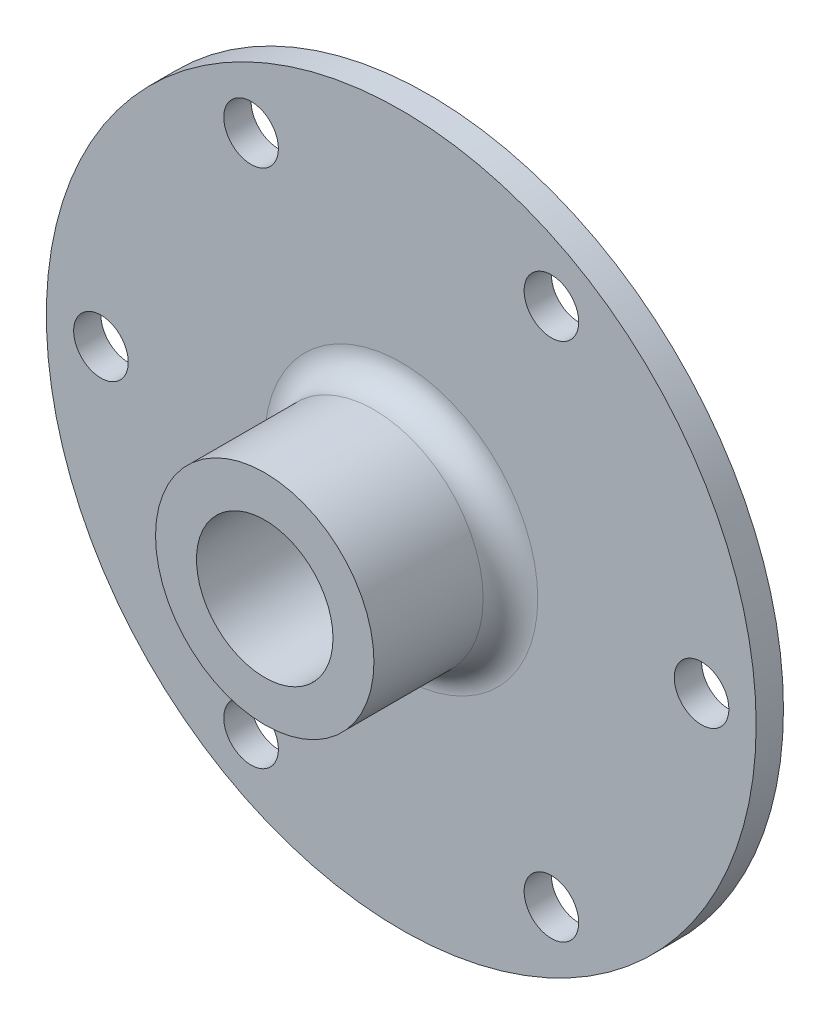
ISO-10303-21;
HEADER;
FILE_DESCRIPTION(('STEP AP214'),'2;1');
FILE_NAME('part.step','',(''),(''),'','','');
FILE_SCHEMA(('AUTOMOTIVE_DESIGN { 1 0 10303 214 1 1 1 1 }'));
ENDSEC;
DATA;
#1=APPLICATION_CONTEXT('core data for automotive mechanical design processes');
#2=APPLICATION_PROTOCOL_DEFINITION('international standard','automotive_design',2000,#1);
#3=PRODUCT_CONTEXT('',#1,'mechanical');
#4=PRODUCT('Part','Part','',(#3));
#5=PRODUCT_RELATED_PRODUCT_CATEGORY('part','',(#4));
#6=PRODUCT_DEFINITION_FORMATION('','',#4);
#7=PRODUCT_DEFINITION_CONTEXT('part definition',#1,'design');
#8=PRODUCT_DEFINITION('design','',#6,#7);
#9=PRODUCT_DEFINITION_SHAPE('','',#8);
#10=(LENGTH_UNIT() NAMED_UNIT(*) SI_UNIT(.MILLI.,.METRE.));
#11=(NAMED_UNIT(*) PLANE_ANGLE_UNIT() SI_UNIT($,.RADIAN.));
#12=(NAMED_UNIT(*) SI_UNIT($,.STERADIAN.) SOLID_ANGLE_UNIT());
#13=UNCERTAINTY_MEASURE_WITH_UNIT(LENGTH_MEASURE(1.E-05),#10,'distance_accuracy_value','');
#14=(GEOMETRIC_REPRESENTATION_CONTEXT(3) GLOBAL_UNCERTAINTY_ASSIGNED_CONTEXT((#13)) GLOBAL_UNIT_ASSIGNED_CONTEXT((#10,
#11,#12)) REPRESENTATION_CONTEXT('',''));
#15=CARTESIAN_POINT('',(0.,0.,0.));
#16=DIRECTION('',(0.,0.,1.));
#17=DIRECTION('',(1.,0.,0.));
#18=AXIS2_PLACEMENT_3D('',#15,#16,#17);
#19=CARTESIAN_POINT('',(17.4625000000004,-30.2459372271713,0.));
#20=DIRECTION('',(0.,0.,1.));
#21=DIRECTION('',(0.50000000000001,-0.866025403784433,0.));
#22=AXIS2_PLACEMENT_3D('',#19,#20,#21);
#23=CYLINDRICAL_SURFACE('',#22,3.175);
#24=CARTESIAN_POINT('',(17.4625000000004,-30.2459372271713,0.));
#25=DIRECTION('',(0.,0.,1.));
#26=DIRECTION('',(0.50000000000001,-0.866025403784433,0.));
#27=AXIS2_PLACEMENT_3D('',#24,#25,#26);
#28=CIRCLE('',#27,3.175);
#29=CARTESIAN_POINT('',(19.0500000000004,-32.9955678841869,0.));
#30=VERTEX_POINT('',#29);
#31=EDGE_CURVE('E49',#30,#30,#28,.T.);
#32=ORIENTED_EDGE('',*,*,#31,.F.);
#33=EDGE_LOOP('',(#32));
#34=FACE_BOUND('',#33,.T.);
#35=CARTESIAN_POINT('',(17.4625000000004,-30.2459372271713,3.17500000000001));
#36=DIRECTION('',(0.,0.,1.));
#37=DIRECTION('',(0.50000000000001,-0.866025403784433,0.));
#38=AXIS2_PLACEMENT_3D('',#35,#36,#37);
#39=CIRCLE('',#38,3.175);
#40=CARTESIAN_POINT('',(19.0500000000004,-32.9955678841869,3.17500000000001));
#41=VERTEX_POINT('',#40);
#42=EDGE_CURVE('E45',#41,#41,#39,.T.);
#43=ORIENTED_EDGE('',*,*,#42,.T.);
#44=EDGE_LOOP('',(#43));
#45=FACE_BOUND('',#44,.T.);
#46=ADVANCED_FACE('F34',(#34,#45),#23,.F.);
#47=CARTESIAN_POINT('',(-17.4624999999997,-30.2459372271717,0.));
#48=DIRECTION('',(0.,0.,1.));
#49=DIRECTION('',(-0.499999999999992,-0.866025403784443,0.));
#50=AXIS2_PLACEMENT_3D('',#47,#48,#49);
#51=CYLINDRICAL_SURFACE('',#50,3.175);
#52=CARTESIAN_POINT('',(-17.4624999999997,-30.2459372271717,0.));
#53=DIRECTION('',(0.,0.,1.));
#54=DIRECTION('',(-0.499999999999992,-0.866025403784443,0.));
#55=AXIS2_PLACEMENT_3D('',#52,#53,#54);
#56=CIRCLE('',#55,3.175);
#57=CARTESIAN_POINT('',(-19.0499999999997,-32.9955678841873,0.));
#58=VERTEX_POINT('',#57);
#59=EDGE_CURVE('E57',#58,#58,#56,.T.);
#60=ORIENTED_EDGE('',*,*,#59,.F.);
#61=EDGE_LOOP('',(#60));
#62=FACE_BOUND('',#61,.T.);
#63=CARTESIAN_POINT('',(-17.4624999999997,-30.2459372271717,3.17500000000001));
#64=DIRECTION('',(0.,0.,1.));
#65=DIRECTION('',(-0.499999999999992,-0.866025403784443,0.));
#66=AXIS2_PLACEMENT_3D('',#63,#64,#65);
#67=CIRCLE('',#66,3.175);
#68=CARTESIAN_POINT('',(-19.0499999999997,-32.9955678841873,3.17500000000001));
#69=VERTEX_POINT('',#68);
#70=EDGE_CURVE('E54',#69,#69,#67,.T.);
#71=ORIENTED_EDGE('',*,*,#70,.T.);
#72=EDGE_LOOP('',(#71));
#73=FACE_BOUND('',#72,.T.);
#74=ADVANCED_FACE('F135',(#62,#73),#51,.F.);
#75=CARTESIAN_POINT('',(-34.925,0.,0.));
#76=DIRECTION('',(0.,0.,1.));
#77=DIRECTION('',(-1.,0.,0.));
#78=AXIS2_PLACEMENT_3D('',#75,#76,#77);
#79=CYLINDRICAL_SURFACE('',#78,3.175);
#80=CARTESIAN_POINT('',(-34.925,0.,0.));
#81=DIRECTION('',(0.,0.,1.));
#82=DIRECTION('',(-1.,0.,0.));
#83=AXIS2_PLACEMENT_3D('',#80,#81,#82);
#84=CIRCLE('',#83,3.175);
#85=CARTESIAN_POINT('',(-38.1,0.,0.));
#86=VERTEX_POINT('',#85);
#87=EDGE_CURVE('E63',#86,#86,#84,.T.);
#88=ORIENTED_EDGE('',*,*,#87,.F.);
#89=EDGE_LOOP('',(#88));
#90=FACE_BOUND('',#89,.T.);
#91=CARTESIAN_POINT('',(-34.925,0.,3.17500000000001));
#92=DIRECTION('',(0.,0.,1.));
#93=DIRECTION('',(-1.,0.,0.));
#94=AXIS2_PLACEMENT_3D('',#91,#92,#93);
#95=CIRCLE('',#94,3.175);
#96=CARTESIAN_POINT('',(-38.1,0.,3.17500000000001));
#97=VERTEX_POINT('',#96);
#98=EDGE_CURVE('E60',#97,#97,#95,.T.);
#99=ORIENTED_EDGE('',*,*,#98,.T.);
#100=EDGE_LOOP('',(#99));
#101=FACE_BOUND('',#100,.T.);
#102=ADVANCED_FACE('F140',(#90,#101),#79,.F.);
#103=CARTESIAN_POINT('',(-17.4625000000001,30.2459372271714,0.));
#104=DIRECTION('',(0.,0.,1.));
#105=DIRECTION('',(-0.500000000000004,0.866025403784436,0.));
#106=AXIS2_PLACEMENT_3D('',#103,#104,#105);
#107=CYLINDRICAL_SURFACE('',#106,3.175);
#108=CARTESIAN_POINT('',(-17.4625000000001,30.2459372271714,0.));
#109=DIRECTION('',(0.,0.,1.));
#110=DIRECTION('',(-0.500000000000004,0.866025403784436,0.));
#111=AXIS2_PLACEMENT_3D('',#108,#109,#110);
#112=CIRCLE('',#111,3.175);
#113=CARTESIAN_POINT('',(-19.0500000000002,32.995567884187,0.));
#114=VERTEX_POINT('',#113);
#115=EDGE_CURVE('E69',#114,#114,#112,.T.);
#116=ORIENTED_EDGE('',*,*,#115,.F.);
#117=EDGE_LOOP('',(#116));
#118=FACE_BOUND('',#117,.T.);
#119=CARTESIAN_POINT('',(-17.4625000000001,30.2459372271714,3.17500000000001));
#120=DIRECTION('',(0.,0.,1.));
#121=DIRECTION('',(-0.500000000000004,0.866025403784436,0.));
#122=AXIS2_PLACEMENT_3D('',#119,#120,#121);
#123=CIRCLE('',#122,3.175);
#124=CARTESIAN_POINT('',(-19.0500000000002,32.995567884187,3.17500000000001));
#125=VERTEX_POINT('',#124);
#126=EDGE_CURVE('E66',#125,#125,#123,.T.);
#127=ORIENTED_EDGE('',*,*,#126,.T.);
#128=EDGE_LOOP('',(#127));
#129=FACE_BOUND('',#128,.T.);
#130=ADVANCED_FACE('F130',(#118,#129),#107,.F.);
#131=CARTESIAN_POINT('',(17.4624999999999,30.2459372271716,0.));
#132=DIRECTION('',(0.,0.,1.));
#133=DIRECTION('',(0.499999999999998,0.86602540378444,0.));
#134=AXIS2_PLACEMENT_3D('',#131,#132,#133);
#135=CYLINDRICAL_SURFACE('',#134,3.175);
#136=CARTESIAN_POINT('',(17.4624999999999,30.2459372271716,0.));
#137=DIRECTION('',(0.,0.,1.));
#138=DIRECTION('',(0.499999999999998,0.86602540378444,0.));
#139=AXIS2_PLACEMENT_3D('',#136,#137,#138);
#140=CIRCLE('',#139,3.175);
#141=CARTESIAN_POINT('',(19.0499999999999,32.9955678841872,0.));
#142=VERTEX_POINT('',#141);
#143=EDGE_CURVE('E75',#142,#142,#140,.T.);
#144=ORIENTED_EDGE('',*,*,#143,.F.);
#145=EDGE_LOOP('',(#144));
#146=FACE_BOUND('',#145,.T.);
#147=CARTESIAN_POINT('',(17.4624999999999,30.2459372271716,3.17500000000001));
#148=DIRECTION('',(0.,0.,1.));
#149=DIRECTION('',(0.499999999999998,0.86602540378444,0.));
#150=AXIS2_PLACEMENT_3D('',#147,#148,#149);
#151=CIRCLE('',#150,3.175);
#152=CARTESIAN_POINT('',(19.0499999999999,32.9955678841872,3.17500000000001));
#153=VERTEX_POINT('',#152);
#154=EDGE_CURVE('E72',#153,#153,#151,.T.);
#155=ORIENTED_EDGE('',*,*,#154,.T.);
#156=EDGE_LOOP('',(#155));
#157=FACE_BOUND('',#156,.T.);
#158=ADVANCED_FACE('F124',(#146,#157),#135,.F.);
#159=CARTESIAN_POINT('',(0.,0.,0.));
#160=DIRECTION('',(0.,0.,1.));
#161=DIRECTION('',(1.,0.,0.));
#162=AXIS2_PLACEMENT_3D('',#159,#160,#161);
#163=PLANE('',#162);
#164=ORIENTED_EDGE('',*,*,#31,.T.);
#165=EDGE_LOOP('',(#164));
#166=FACE_BOUND('',#165,.T.);
#167=ORIENTED_EDGE('',*,*,#59,.T.);
#168=EDGE_LOOP('',(#167));
#169=FACE_BOUND('',#168,.T.);
#170=ORIENTED_EDGE('',*,*,#87,.T.);
#171=EDGE_LOOP('',(#170));
#172=FACE_BOUND('',#171,.T.);
#173=ORIENTED_EDGE('',*,*,#115,.T.);
#174=EDGE_LOOP('',(#173));
#175=FACE_BOUND('',#174,.T.);
#176=ORIENTED_EDGE('',*,*,#143,.T.);
#177=EDGE_LOOP('',(#176));
#178=FACE_BOUND('',#177,.T.);
#179=CARTESIAN_POINT('',(34.925,0.,0.));
#180=DIRECTION('',(0.,0.,1.));
#181=DIRECTION('',(1.,0.,0.));
#182=AXIS2_PLACEMENT_3D('',#179,#180,#181);
#183=CIRCLE('',#182,3.175);
#184=CARTESIAN_POINT('',(38.1,0.,0.));
#185=VERTEX_POINT('',#184);
#186=EDGE_CURVE('E91',#185,#185,#183,.T.);
#187=ORIENTED_EDGE('',*,*,#186,.T.);
#188=EDGE_LOOP('',(#187));
#189=FACE_BOUND('',#188,.T.);
#190=CARTESIAN_POINT('',(0.,0.,0.));
#191=DIRECTION('',(0.,0.,1.));
#192=DIRECTION('',(1.,0.,0.));
#193=AXIS2_PLACEMENT_3D('',#190,#191,#192);
#194=CIRCLE('',#193,7.9375);
#195=CARTESIAN_POINT('',(7.9375,0.,0.));
#196=VERTEX_POINT('',#195);
#197=EDGE_CURVE('E87',#196,#196,#194,.T.);
#198=ORIENTED_EDGE('',*,*,#197,.T.);
#199=EDGE_LOOP('',(#198));
#200=FACE_BOUND('',#199,.T.);
#201=CARTESIAN_POINT('',(0.,0.,0.));
#202=DIRECTION('',(0.,0.,1.));
#203=DIRECTION('',(1.,0.,0.));
#204=AXIS2_PLACEMENT_3D('',#201,#202,#203);
#205=CIRCLE('',#204,41.275);
#206=CARTESIAN_POINT('',(41.275,0.,0.));
#207=VERTEX_POINT('',#206);
#208=EDGE_CURVE('E78',#207,#207,#205,.T.);
#209=ORIENTED_EDGE('',*,*,#208,.F.);
#210=EDGE_LOOP('',(#209));
#211=FACE_BOUND('',#210,.T.);
#212=ADVANCED_FACE('F100',(#166,#169,#172,#175,#178,#189,#200,#211),#163,.F.);
#213=CARTESIAN_POINT('',(0.,0.,19.05));
#214=DIRECTION('',(0.,0.,1.));
#215=DIRECTION('',(1.,0.,0.));
#216=AXIS2_PLACEMENT_3D('',#213,#214,#215);
#217=CYLINDRICAL_SURFACE('',#216,41.275);
#218=CARTESIAN_POINT('',(0.,0.,3.17500000000001));
#219=DIRECTION('',(0.,0.,1.));
#220=DIRECTION('',(1.,0.,0.));
#221=AXIS2_PLACEMENT_3D('',#218,#219,#220);
#222=CIRCLE('',#221,41.275);
#223=CARTESIAN_POINT('',(41.275,0.,3.17500000000001));
#224=VERTEX_POINT('',#223);
#225=EDGE_CURVE('E81',#224,#224,#222,.T.);
#226=ORIENTED_EDGE('',*,*,#225,.F.);
#227=EDGE_LOOP('',(#226));
#228=FACE_BOUND('',#227,.T.);
#229=ORIENTED_EDGE('',*,*,#208,.T.);
#230=EDGE_LOOP('',(#229));
#231=FACE_BOUND('',#230,.T.);
#232=ADVANCED_FACE('F114',(#228,#231),#217,.T.);
#233=CARTESIAN_POINT('',(0.,12.7,3.17500000000001));
#234=DIRECTION('',(0.,0.,-1.));
#235=DIRECTION('',(-1.,0.,0.));
#236=AXIS2_PLACEMENT_3D('',#233,#234,#235);
#237=PLANE('',#236);
#238=CARTESIAN_POINT('',(0.,0.,3.17500000000001));
#239=DIRECTION('',(0.,0.,-1.));
#240=DIRECTION('',(-1.,0.,0.));
#241=AXIS2_PLACEMENT_3D('',#238,#239,#240);
#242=CIRCLE('',#241,15.875);
#243=CARTESIAN_POINT('',(-15.875,0.,3.17500000000001));
#244=VERTEX_POINT('',#243);
#245=EDGE_CURVE('E10',#244,#244,#242,.T.);
#246=ORIENTED_EDGE('',*,*,#245,.T.);
#247=EDGE_LOOP('',(#246));
#248=FACE_BOUND('',#247,.T.);
#249=ORIENTED_EDGE('',*,*,#42,.F.);
#250=EDGE_LOOP('',(#249));
#251=FACE_BOUND('',#250,.T.);
#252=ORIENTED_EDGE('',*,*,#70,.F.);
#253=EDGE_LOOP('',(#252));
#254=FACE_BOUND('',#253,.T.);
#255=ORIENTED_EDGE('',*,*,#98,.F.);
#256=EDGE_LOOP('',(#255));
#257=FACE_BOUND('',#256,.T.);
#258=ORIENTED_EDGE('',*,*,#126,.F.);
#259=EDGE_LOOP('',(#258));
#260=FACE_BOUND('',#259,.T.);
#261=ORIENTED_EDGE('',*,*,#154,.F.);
#262=EDGE_LOOP('',(#261));
#263=FACE_BOUND('',#262,.T.);
#264=CARTESIAN_POINT('',(34.925,0.,3.17500000000001));
#265=DIRECTION('',(0.,0.,1.));
#266=DIRECTION('',(1.,0.,0.));
#267=AXIS2_PLACEMENT_3D('',#264,#265,#266);
#268=CIRCLE('',#267,3.175);
#269=CARTESIAN_POINT('',(38.1,0.,3.17500000000001));
#270=VERTEX_POINT('',#269);
#271=EDGE_CURVE('E94',#270,#270,#268,.T.);
#272=ORIENTED_EDGE('',*,*,#271,.F.);
#273=EDGE_LOOP('',(#272));
#274=FACE_BOUND('',#273,.T.);
#275=ORIENTED_EDGE('',*,*,#225,.T.);
#276=EDGE_LOOP('',(#275));
#277=FACE_BOUND('',#276,.T.);
#278=ADVANCED_FACE('F110',(#248,#251,#254,#257,#260,#263,#274,#277),#237,.F.);
#279=CARTESIAN_POINT('',(0.,0.,19.05));
#280=DIRECTION('',(0.,0.,1.));
#281=DIRECTION('',(1.,0.,0.));
#282=AXIS2_PLACEMENT_3D('',#279,#280,#281);
#283=CYLINDRICAL_SURFACE('',#282,12.7);
#284=CARTESIAN_POINT('',(0.,0.,6.34999999999999));
#285=DIRECTION('',(0.,0.,-1.));
#286=DIRECTION('',(-1.,0.,0.));
#287=AXIS2_PLACEMENT_3D('',#284,#285,#286);
#288=CIRCLE('',#287,12.7);
#289=CARTESIAN_POINT('',(-12.7,0.,6.34999999999999));
#290=VERTEX_POINT('',#289);
#291=EDGE_CURVE('E41',#290,#290,#288,.F.);
#292=ORIENTED_EDGE('',*,*,#291,.T.);
#293=EDGE_LOOP('',(#292));
#294=FACE_BOUND('',#293,.T.);
#295=CARTESIAN_POINT('',(0.,0.,19.05));
#296=DIRECTION('',(0.,0.,1.));
#297=DIRECTION('',(1.,0.,0.));
#298=AXIS2_PLACEMENT_3D('',#295,#296,#297);
#299=CIRCLE('',#298,12.7);
#300=CARTESIAN_POINT('',(12.7,0.,19.05));
#301=VERTEX_POINT('',#300);
#302=EDGE_CURVE('E84',#301,#301,#299,.T.);
#303=ORIENTED_EDGE('',*,*,#302,.F.);
#304=EDGE_LOOP('',(#303));
#305=FACE_BOUND('',#304,.T.);
#306=ADVANCED_FACE('F113',(#294,#305),#283,.T.);
#307=CARTESIAN_POINT('',(0.,12.7,19.05));
#308=DIRECTION('',(0.,0.,-1.));
#309=DIRECTION('',(-1.,0.,0.));
#310=AXIS2_PLACEMENT_3D('',#307,#308,#309);
#311=PLANE('',#310);
#312=CARTESIAN_POINT('',(0.,0.,19.05));
#313=DIRECTION('',(0.,0.,1.));
#314=DIRECTION('',(1.,0.,0.));
#315=AXIS2_PLACEMENT_3D('',#312,#313,#314);
#316=CIRCLE('',#315,7.9375);
#317=CARTESIAN_POINT('',(7.9375,0.,19.05));
#318=VERTEX_POINT('',#317);
#319=EDGE_CURVE('E88',#318,#318,#316,.T.);
#320=ORIENTED_EDGE('',*,*,#319,.F.);
#321=EDGE_LOOP('',(#320));
#322=FACE_BOUND('',#321,.T.);
#323=ORIENTED_EDGE('',*,*,#302,.T.);
#324=EDGE_LOOP('',(#323));
#325=FACE_BOUND('',#324,.T.);
#326=ADVANCED_FACE('F195',(#322,#325),#311,.F.);
#327=CARTESIAN_POINT('',(0.,0.,0.));
#328=DIRECTION('',(0.,0.,1.));
#329=DIRECTION('',(1.,0.,0.));
#330=AXIS2_PLACEMENT_3D('',#327,#328,#329);
#331=CYLINDRICAL_SURFACE('',#330,7.9375);
#332=CARTESIAN_POINT('',(7.9375,0.,0.));
#333=CARTESIAN_POINT('',(7.9375,0.,0.1984375));
#334=CARTESIAN_POINT('',(7.9375,0.,0.396875));
#335=CARTESIAN_POINT('',(7.9375,0.,0.79375));
#336=CARTESIAN_POINT('',(7.9375,0.,0.9921875));
#337=CARTESIAN_POINT('',(7.9375,0.,1.3890625));
#338=CARTESIAN_POINT('',(7.9375,0.,1.5875));
#339=CARTESIAN_POINT('',(7.9375,0.,1.984375));
#340=CARTESIAN_POINT('',(7.9375,0.,2.1828125));
#341=CARTESIAN_POINT('',(7.9375,0.,2.5796875));
#342=CARTESIAN_POINT('',(7.9375,0.,2.778125));
#343=CARTESIAN_POINT('',(7.9375,0.,3.175));
#344=CARTESIAN_POINT('',(7.9375,0.,3.3734375));
#345=CARTESIAN_POINT('',(7.9375,0.,3.7703125));
#346=CARTESIAN_POINT('',(7.9375,0.,3.96875));
#347=CARTESIAN_POINT('',(7.9375,0.,4.365625));
#348=CARTESIAN_POINT('',(7.9375,0.,4.5640625));
#349=CARTESIAN_POINT('',(7.9375,0.,4.9609375));
#350=CARTESIAN_POINT('',(7.9375,0.,5.159375));
#351=CARTESIAN_POINT('',(7.9375,0.,5.55625));
#352=CARTESIAN_POINT('',(7.9375,0.,5.7546875));
#353=CARTESIAN_POINT('',(7.9375,0.,6.1515625));
#354=CARTESIAN_POINT('',(7.9375,0.,6.35));
#355=CARTESIAN_POINT('',(7.9375,0.,6.746875));
#356=CARTESIAN_POINT('',(7.9375,0.,6.9453125));
#357=CARTESIAN_POINT('',(7.9375,0.,7.3421875));
#358=CARTESIAN_POINT('',(7.9375,0.,7.540625));
#359=CARTESIAN_POINT('',(7.9375,0.,7.9375));
#360=CARTESIAN_POINT('',(7.9375,0.,8.1359375));
#361=CARTESIAN_POINT('',(7.9375,0.,8.5328125));
#362=CARTESIAN_POINT('',(7.9375,0.,8.73125));
#363=CARTESIAN_POINT('',(7.9375,0.,9.128125));
#364=CARTESIAN_POINT('',(7.9375,0.,9.3265625));
#365=CARTESIAN_POINT('',(7.9375,0.,9.7234375));
#366=CARTESIAN_POINT('',(7.9375,0.,9.921875));
#367=CARTESIAN_POINT('',(7.9375,0.,10.31875));
#368=CARTESIAN_POINT('',(7.9375,0.,10.5171875));
#369=CARTESIAN_POINT('',(7.9375,0.,10.9140625));
#370=CARTESIAN_POINT('',(7.9375,0.,11.1125));
#371=CARTESIAN_POINT('',(7.9375,0.,11.509375));
#372=CARTESIAN_POINT('',(7.9375,0.,11.7078125));
#373=CARTESIAN_POINT('',(7.9375,0.,12.1046875));
#374=CARTESIAN_POINT('',(7.9375,0.,12.303125));
#375=CARTESIAN_POINT('',(7.9375,0.,12.7));
#376=CARTESIAN_POINT('',(7.9375,0.,12.8984375));
#377=CARTESIAN_POINT('',(7.9375,0.,13.2953125));
#378=CARTESIAN_POINT('',(7.9375,0.,13.49375));
#379=CARTESIAN_POINT('',(7.9375,0.,13.890625));
#380=CARTESIAN_POINT('',(7.9375,0.,14.0890625));
#381=CARTESIAN_POINT('',(7.9375,0.,14.4859375));
#382=CARTESIAN_POINT('',(7.9375,0.,14.684375));
#383=CARTESIAN_POINT('',(7.9375,0.,15.08125));
#384=CARTESIAN_POINT('',(7.9375,0.,15.2796875));
#385=CARTESIAN_POINT('',(7.9375,0.,15.6765625));
#386=CARTESIAN_POINT('',(7.9375,0.,15.875));
#387=CARTESIAN_POINT('',(7.9375,0.,16.271875));
#388=CARTESIAN_POINT('',(7.9375,0.,16.4703125));
#389=CARTESIAN_POINT('',(7.9375,0.,16.8671875));
#390=CARTESIAN_POINT('',(7.9375,0.,17.065625));
#391=CARTESIAN_POINT('',(7.9375,0.,17.4625));
#392=CARTESIAN_POINT('',(7.9375,0.,17.6609375));
#393=CARTESIAN_POINT('',(7.9375,0.,18.0578125));
#394=CARTESIAN_POINT('',(7.9375,0.,18.25625));
#395=CARTESIAN_POINT('',(7.9375,0.,18.653125));
#396=CARTESIAN_POINT('',(7.9375,0.,18.8515625));
#397=CARTESIAN_POINT('',(7.9375,0.,19.05));
#398=B_SPLINE_CURVE_WITH_KNOTS('',3,(#332,#333,#334,#335,#336,#337,#338,#339,#340,#341,#342,
#343,#344,#345,#346,#347,#348,#349,#350,#351,#352,#353,#354,#355,#356,#357,#358,#359,#360,#361,
#362,#363,#364,#365,#366,#367,#368,#369,#370,#371,#372,#373,#374,#375,#376,#377,#378,#379,#380,
#381,#382,#383,#384,#385,#386,#387,#388,#389,#390,#391,#392,#393,#394,#395,#396,#397),
.UNSPECIFIED.,.F.,.F.,(4,2,2,2,2,2,2,2,2,2,2,2,2,2,2,2,2,2,2,2,2,2,2,2,2,2,2,2,2,2,2,2,4),(0.,
0.5953125,1.190625,1.7859375,2.38125,2.9765625,3.571875,4.1671875,4.7625,5.3578125,5.953125,
6.5484375,7.14375,7.7390625,8.334375,8.9296875,9.525,10.1203125,10.715625,11.3109375,11.90625,
12.5015625,13.096875,13.6921875,14.2875,14.8828125,15.478125,16.0734375,16.66875,17.2640625,
17.859375,18.4546875,19.05),.UNSPECIFIED.);
#399=EDGE_CURVE('BSEAM106',#196,#318,#398,.T.);
#400=ORIENTED_EDGE('',*,*,#197,.F.);
#401=ORIENTED_EDGE('',*,*,#319,.T.);
#402=ORIENTED_EDGE('',*,*,#399,.T.);
#403=ORIENTED_EDGE('',*,*,#399,.F.);
#404=EDGE_LOOP('',(#400,#402,#401,#403));
#405=FACE_BOUND('',#404,.T.);
#406=ADVANCED_FACE('F106',(#405),#331,.F.);
#407=CARTESIAN_POINT('',(34.925,0.,0.));
#408=DIRECTION('',(0.,0.,1.));
#409=DIRECTION('',(1.,0.,0.));
#410=AXIS2_PLACEMENT_3D('',#407,#408,#409);
#411=CYLINDRICAL_SURFACE('',#410,3.175);
#412=ORIENTED_EDGE('',*,*,#186,.F.);
#413=EDGE_LOOP('',(#412));
#414=FACE_BOUND('',#413,.T.);
#415=ORIENTED_EDGE('',*,*,#271,.T.);
#416=EDGE_LOOP('',(#415));
#417=FACE_BOUND('',#416,.T.);
#418=ADVANCED_FACE('F103',(#414,#417),#411,.F.);
#419=CARTESIAN_POINT('',(0.,0.,6.34999999999999));
#420=DIRECTION('',(0.,0.,-1.));
#421=DIRECTION('',(-1.,0.,0.));
#422=AXIS2_PLACEMENT_3D('',#419,#420,#421);
#423=TOROIDAL_SURFACE('',#422,15.875,3.175);
#424=ORIENTED_EDGE('',*,*,#245,.F.);
#425=EDGE_LOOP('',(#424));
#426=FACE_BOUND('',#425,.T.);
#427=ORIENTED_EDGE('',*,*,#291,.F.);
#428=EDGE_LOOP('',(#427));
#429=FACE_BOUND('',#428,.T.);
#430=ADVANCED_FACE('F36',(#426,#429),#423,.F.);
#431=CLOSED_SHELL('',(#46,#74,#102,#130,#158,#212,#232,#278,#306,#326,#406,#418,#430));
#432=MANIFOLD_SOLID_BREP('B2',#431);
#433=ADVANCED_BREP_SHAPE_REPRESENTATION('',(#18,#432),#14);
#434=SHAPE_DEFINITION_REPRESENTATION(#9,#433);
ENDSEC;
END-ISO-10303-21;
